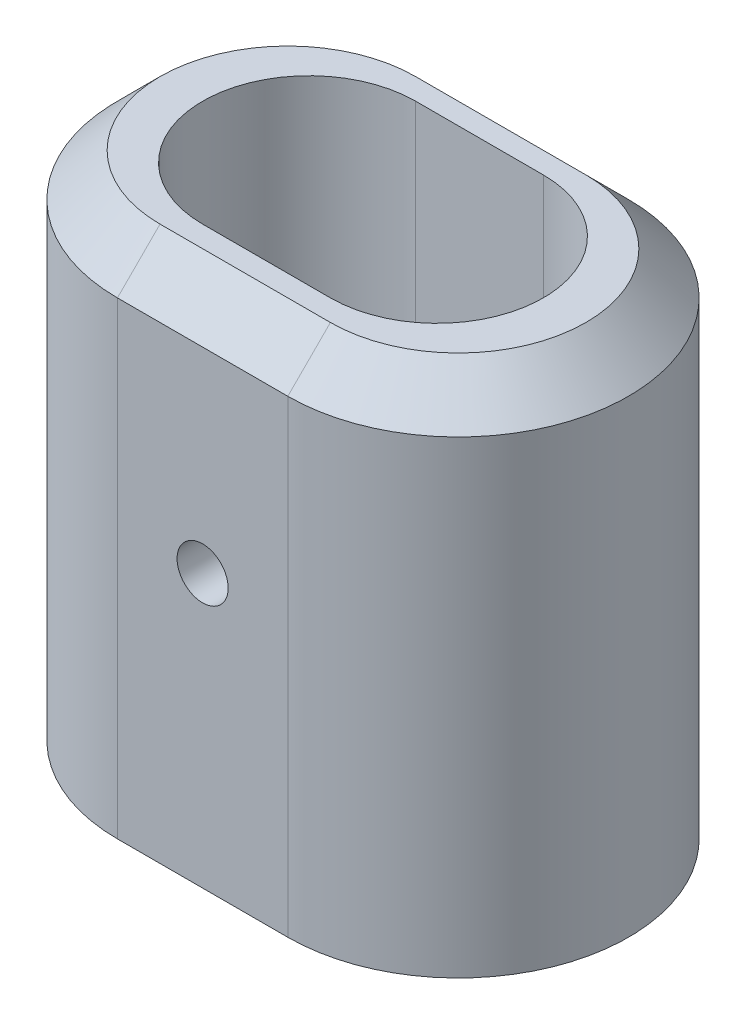
ISO-10303-21;
HEADER;
FILE_DESCRIPTION(('STEP AP214'),'2;1');
FILE_NAME('part.step','',(''),(''),'','','');
FILE_SCHEMA(('AUTOMOTIVE_DESIGN { 1 0 10303 214 1 1 1 1 }'));
ENDSEC;
DATA;
#1=APPLICATION_CONTEXT('core data for automotive mechanical design processes');
#2=APPLICATION_PROTOCOL_DEFINITION('international standard','automotive_design',2000,#1);
#3=PRODUCT_CONTEXT('',#1,'mechanical');
#4=PRODUCT('Part','Part','',(#3));
#5=PRODUCT_RELATED_PRODUCT_CATEGORY('part','',(#4));
#6=PRODUCT_DEFINITION_FORMATION('','',#4);
#7=PRODUCT_DEFINITION_CONTEXT('part definition',#1,'design');
#8=PRODUCT_DEFINITION('design','',#6,#7);
#9=PRODUCT_DEFINITION_SHAPE('','',#8);
#10=(LENGTH_UNIT() NAMED_UNIT(*) SI_UNIT(.MILLI.,.METRE.));
#11=(NAMED_UNIT(*) PLANE_ANGLE_UNIT() SI_UNIT($,.RADIAN.));
#12=(NAMED_UNIT(*) SI_UNIT($,.STERADIAN.) SOLID_ANGLE_UNIT());
#13=UNCERTAINTY_MEASURE_WITH_UNIT(LENGTH_MEASURE(1.E-05),#10,'distance_accuracy_value','');
#14=(GEOMETRIC_REPRESENTATION_CONTEXT(3) GLOBAL_UNCERTAINTY_ASSIGNED_CONTEXT((#13)) GLOBAL_UNIT_ASSIGNED_CONTEXT((#10,
#11,#12)) REPRESENTATION_CONTEXT('',''));
#15=CARTESIAN_POINT('',(0.,0.,0.));
#16=DIRECTION('',(0.,0.,1.));
#17=DIRECTION('',(1.,0.,0.));
#18=AXIS2_PLACEMENT_3D('',#15,#16,#17);
#19=CARTESIAN_POINT('',(-9.99999999999999,60.,0.));
#20=DIRECTION('',(0.,1.,0.));
#21=DIRECTION('',(0.,0.,1.));
#22=AXIS2_PLACEMENT_3D('',#19,#20,#21);
#23=PLANE('',#22);
#24=DIRECTION('',(-1.,0.,0.));
#25=VECTOR('',#24,1.);
#26=CARTESIAN_POINT('',(-9.99999999999999,60.,-15.));
#27=LINE('',#26,#25);
#28=CARTESIAN_POINT('',(9.99999999999999,60.,-15.));
#29=VERTEX_POINT('',#28);
#30=CARTESIAN_POINT('',(-9.99999999999999,60.,-15.));
#31=VERTEX_POINT('',#30);
#32=EDGE_CURVE('E183',#29,#31,#27,.T.);
#33=ORIENTED_EDGE('',*,*,#32,.T.);
#34=CARTESIAN_POINT('',(-9.99999999999999,60.,0.));
#35=DIRECTION('',(0.,1.,0.));
#36=DIRECTION('',(0.,0.,1.));
#37=AXIS2_PLACEMENT_3D('',#34,#35,#36);
#38=CIRCLE('',#37,15.);
#39=CARTESIAN_POINT('',(-9.99999999999999,60.,15.));
#40=VERTEX_POINT('',#39);
#41=EDGE_CURVE('E187',#31,#40,#38,.T.);
#42=ORIENTED_EDGE('',*,*,#41,.T.);
#43=DIRECTION('',(1.,0.,0.));
#44=VECTOR('',#43,1.);
#45=CARTESIAN_POINT('',(9.99999999999999,60.,15.));
#46=LINE('',#45,#44);
#47=CARTESIAN_POINT('',(9.99999999999999,60.,15.));
#48=VERTEX_POINT('',#47);
#49=EDGE_CURVE('E185',#40,#48,#46,.T.);
#50=ORIENTED_EDGE('',*,*,#49,.T.);
#51=CARTESIAN_POINT('',(9.99999999999999,60.,0.));
#52=DIRECTION('',(0.,1.,0.));
#53=DIRECTION('',(0.,0.,1.));
#54=AXIS2_PLACEMENT_3D('',#51,#52,#53);
#55=CIRCLE('',#54,15.);
#56=EDGE_CURVE('E181',#48,#29,#55,.T.);
#57=ORIENTED_EDGE('',*,*,#56,.T.);
#58=EDGE_LOOP('',(#33,#42,#50,#57));
#59=FACE_BOUND('',#58,.T.);
#60=DIRECTION('',(1.,0.,0.));
#61=VECTOR('',#60,1.);
#62=CARTESIAN_POINT('',(-7.5,60.,12.5));
#63=LINE('',#62,#61);
#64=CARTESIAN_POINT('',(-7.5,60.,12.5));
#65=VERTEX_POINT('',#64);
#66=CARTESIAN_POINT('',(7.5,60.,12.5));
#67=VERTEX_POINT('',#66);
#68=EDGE_CURVE('E129',#65,#67,#63,.T.);
#69=ORIENTED_EDGE('',*,*,#68,.F.);
#70=CARTESIAN_POINT('',(-7.5,60.,0.));
#71=DIRECTION('',(0.,1.,0.));
#72=DIRECTION('',(0.,0.,1.));
#73=AXIS2_PLACEMENT_3D('',#70,#71,#72);
#74=CIRCLE('',#73,12.5);
#75=CARTESIAN_POINT('',(-7.5,60.,-12.5));
#76=VERTEX_POINT('',#75);
#77=EDGE_CURVE('E119',#76,#65,#74,.T.);
#78=ORIENTED_EDGE('',*,*,#77,.F.);
#79=DIRECTION('',(-1.,0.,0.));
#80=VECTOR('',#79,1.);
#81=CARTESIAN_POINT('',(-7.5,60.,-12.5));
#82=LINE('',#81,#80);
#83=CARTESIAN_POINT('',(7.5,60.,-12.5));
#84=VERTEX_POINT('',#83);
#85=EDGE_CURVE('E144',#84,#76,#82,.T.);
#86=ORIENTED_EDGE('',*,*,#85,.F.);
#87=CARTESIAN_POINT('',(7.5,60.,0.));
#88=DIRECTION('',(0.,1.,0.));
#89=DIRECTION('',(0.,0.,1.));
#90=AXIS2_PLACEMENT_3D('',#87,#88,#89);
#91=CIRCLE('',#90,12.5);
#92=EDGE_CURVE('E142',#67,#84,#91,.T.);
#93=ORIENTED_EDGE('',*,*,#92,.F.);
#94=EDGE_LOOP('',(#69,#78,#86,#93));
#95=FACE_BOUND('',#94,.T.);
#96=ADVANCED_FACE('F40',(#59,#95),#23,.T.);
#97=CARTESIAN_POINT('',(-9.99999999999999,0.,0.));
#98=DIRECTION('',(0.,1.,0.));
#99=DIRECTION('',(0.,0.,1.));
#100=AXIS2_PLACEMENT_3D('',#97,#98,#99);
#101=PLANE('',#100);
#102=CARTESIAN_POINT('',(-9.99999999999999,0.,0.));
#103=DIRECTION('',(0.,1.,0.));
#104=DIRECTION('',(0.,0.,1.));
#105=AXIS2_PLACEMENT_3D('',#102,#103,#104);
#106=CIRCLE('',#105,20.);
#107=CARTESIAN_POINT('',(-9.99999999999999,0.,-20.));
#108=VERTEX_POINT('',#107);
#109=CARTESIAN_POINT('',(-9.99999999999999,0.,20.));
#110=VERTEX_POINT('',#109);
#111=EDGE_CURVE('E137',#108,#110,#106,.T.);
#112=ORIENTED_EDGE('',*,*,#111,.F.);
#113=DIRECTION('',(-1.,0.,0.));
#114=VECTOR('',#113,1.);
#115=CARTESIAN_POINT('',(-9.99999999999999,0.,-20.));
#116=LINE('',#115,#114);
#117=CARTESIAN_POINT('',(9.99999999999999,0.,-20.));
#118=VERTEX_POINT('',#117);
#119=EDGE_CURVE('E170',#118,#108,#116,.T.);
#120=ORIENTED_EDGE('',*,*,#119,.F.);
#121=CARTESIAN_POINT('',(9.99999999999999,0.,0.));
#122=DIRECTION('',(0.,1.,0.));
#123=DIRECTION('',(0.,0.,1.));
#124=AXIS2_PLACEMENT_3D('',#121,#122,#123);
#125=CIRCLE('',#124,20.);
#126=CARTESIAN_POINT('',(9.99999999999999,0.,20.));
#127=VERTEX_POINT('',#126);
#128=EDGE_CURVE('E167',#127,#118,#125,.T.);
#129=ORIENTED_EDGE('',*,*,#128,.F.);
#130=DIRECTION('',(1.,0.,0.));
#131=VECTOR('',#130,1.);
#132=CARTESIAN_POINT('',(-9.99999999999999,0.,20.));
#133=LINE('',#132,#131);
#134=EDGE_CURVE('E164',#110,#127,#133,.T.);
#135=ORIENTED_EDGE('',*,*,#134,.F.);
#136=EDGE_LOOP('',(#112,#120,#129,#135));
#137=FACE_BOUND('',#136,.T.);
#138=CARTESIAN_POINT('',(-7.5,0.,0.));
#139=DIRECTION('',(0.,1.,0.));
#140=DIRECTION('',(0.,0.,1.));
#141=AXIS2_PLACEMENT_3D('',#138,#139,#140);
#142=CIRCLE('',#141,12.5);
#143=CARTESIAN_POINT('',(-7.5,0.,-12.5));
#144=VERTEX_POINT('',#143);
#145=CARTESIAN_POINT('',(-7.5,0.,12.5));
#146=VERTEX_POINT('',#145);
#147=EDGE_CURVE('E149',#144,#146,#142,.T.);
#148=ORIENTED_EDGE('',*,*,#147,.T.);
#149=DIRECTION('',(1.,0.,0.));
#150=VECTOR('',#149,1.);
#151=CARTESIAN_POINT('',(-7.5,0.,12.5));
#152=LINE('',#151,#150);
#153=CARTESIAN_POINT('',(7.5,0.,12.5));
#154=VERTEX_POINT('',#153);
#155=EDGE_CURVE('E136',#146,#154,#152,.T.);
#156=ORIENTED_EDGE('',*,*,#155,.T.);
#157=CARTESIAN_POINT('',(7.5,0.,0.));
#158=DIRECTION('',(0.,1.,0.));
#159=DIRECTION('',(0.,0.,1.));
#160=AXIS2_PLACEMENT_3D('',#157,#158,#159);
#161=CIRCLE('',#160,12.5);
#162=CARTESIAN_POINT('',(7.5,0.,-12.5));
#163=VERTEX_POINT('',#162);
#164=EDGE_CURVE('E153',#154,#163,#161,.T.);
#165=ORIENTED_EDGE('',*,*,#164,.T.);
#166=DIRECTION('',(-1.,0.,0.));
#167=VECTOR('',#166,1.);
#168=CARTESIAN_POINT('',(-7.5,0.,-12.5));
#169=LINE('',#168,#167);
#170=EDGE_CURVE('E130',#163,#144,#169,.T.);
#171=ORIENTED_EDGE('',*,*,#170,.T.);
#172=EDGE_LOOP('',(#148,#156,#165,#171));
#173=FACE_BOUND('',#172,.T.);
#174=ADVANCED_FACE('F230',(#137,#173),#101,.F.);
#175=CARTESIAN_POINT('',(-9.99999999999999,60.,0.));
#176=DIRECTION('',(0.,-1.,0.));
#177=DIRECTION('',(0.,0.,-1.));
#178=AXIS2_PLACEMENT_3D('',#175,#176,#177);
#179=CYLINDRICAL_SURFACE('',#178,20.);
#180=DIRECTION('',(0.,-1.,0.));
#181=VECTOR('',#180,1.);
#182=CARTESIAN_POINT('',(-9.99999999999999,60.,20.));
#183=LINE('',#182,#181);
#184=CARTESIAN_POINT('',(-9.99999999999999,55.,20.));
#185=VERTEX_POINT('',#184);
#186=EDGE_CURVE('E179',#185,#110,#183,.T.);
#187=ORIENTED_EDGE('',*,*,#186,.F.);
#188=CARTESIAN_POINT('',(-9.99999999999999,55.,0.));
#189=DIRECTION('',(0.,1.,0.));
#190=DIRECTION('',(0.,0.,1.));
#191=AXIS2_PLACEMENT_3D('',#188,#189,#190);
#192=CIRCLE('',#191,20.);
#193=CARTESIAN_POINT('',(-9.99999999999999,55.,-20.));
#194=VERTEX_POINT('',#193);
#195=EDGE_CURVE('E190',#185,#194,#192,.F.);
#196=ORIENTED_EDGE('',*,*,#195,.T.);
#197=DIRECTION('',(0.,-1.,0.));
#198=VECTOR('',#197,1.);
#199=CARTESIAN_POINT('',(-9.99999999999999,60.,-20.));
#200=LINE('',#199,#198);
#201=EDGE_CURVE('E173',#194,#108,#200,.T.);
#202=ORIENTED_EDGE('',*,*,#201,.T.);
#203=ORIENTED_EDGE('',*,*,#111,.T.);
#204=EDGE_LOOP('',(#187,#196,#202,#203));
#205=FACE_BOUND('',#204,.T.);
#206=ADVANCED_FACE('F223',(#205),#179,.T.);
#207=CARTESIAN_POINT('',(-9.99999999999999,60.,20.));
#208=DIRECTION('',(0.,0.,-1.));
#209=DIRECTION('',(-1.,0.,0.));
#210=AXIS2_PLACEMENT_3D('',#207,#208,#209);
#211=PLANE('',#210);
#212=CARTESIAN_POINT('',(0.,32.,20.));
#213=DIRECTION('',(0.,0.,1.));
#214=DIRECTION('',(1.,0.,0.));
#215=AXIS2_PLACEMENT_3D('',#212,#213,#214);
#216=CIRCLE('',#215,3.);
#217=CARTESIAN_POINT('',(3.,32.,20.));
#218=VERTEX_POINT('',#217);
#219=EDGE_CURVE('E295',#218,#218,#216,.T.);
#220=ORIENTED_EDGE('',*,*,#219,.F.);
#221=EDGE_LOOP('',(#220));
#222=FACE_BOUND('',#221,.T.);
#223=DIRECTION('',(0.,-1.,0.));
#224=VECTOR('',#223,1.);
#225=CARTESIAN_POINT('',(9.99999999999999,60.,20.));
#226=LINE('',#225,#224);
#227=CARTESIAN_POINT('',(9.99999999999999,55.,20.));
#228=VERTEX_POINT('',#227);
#229=EDGE_CURVE('E177',#228,#127,#226,.T.);
#230=ORIENTED_EDGE('',*,*,#229,.F.);
#231=DIRECTION('',(-1.,0.,0.));
#232=VECTOR('',#231,1.);
#233=CARTESIAN_POINT('',(-9.99999999999999,55.,20.));
#234=LINE('',#233,#232);
#235=EDGE_CURVE('E193',#228,#185,#234,.T.);
#236=ORIENTED_EDGE('',*,*,#235,.T.);
#237=ORIENTED_EDGE('',*,*,#186,.T.);
#238=ORIENTED_EDGE('',*,*,#134,.T.);
#239=EDGE_LOOP('',(#230,#236,#237,#238));
#240=FACE_BOUND('',#239,.T.);
#241=ADVANCED_FACE('F219',(#222,#240),#211,.F.);
#242=CARTESIAN_POINT('',(9.99999999999999,60.,0.));
#243=DIRECTION('',(0.,-1.,0.));
#244=DIRECTION('',(0.,0.,-1.));
#245=AXIS2_PLACEMENT_3D('',#242,#243,#244);
#246=CYLINDRICAL_SURFACE('',#245,20.);
#247=DIRECTION('',(0.,-1.,0.));
#248=VECTOR('',#247,1.);
#249=CARTESIAN_POINT('',(9.99999999999999,60.,-20.));
#250=LINE('',#249,#248);
#251=CARTESIAN_POINT('',(9.99999999999999,55.,-20.));
#252=VERTEX_POINT('',#251);
#253=EDGE_CURVE('E175',#252,#118,#250,.T.);
#254=ORIENTED_EDGE('',*,*,#253,.F.);
#255=CARTESIAN_POINT('',(9.99999999999999,55.,0.));
#256=DIRECTION('',(0.,1.,0.));
#257=DIRECTION('',(0.,0.,1.));
#258=AXIS2_PLACEMENT_3D('',#255,#256,#257);
#259=CIRCLE('',#258,20.);
#260=EDGE_CURVE('E11',#252,#228,#259,.F.);
#261=ORIENTED_EDGE('',*,*,#260,.T.);
#262=ORIENTED_EDGE('',*,*,#229,.T.);
#263=ORIENTED_EDGE('',*,*,#128,.T.);
#264=EDGE_LOOP('',(#254,#261,#262,#263));
#265=FACE_BOUND('',#264,.T.);
#266=ADVANCED_FACE('F243',(#265),#246,.T.);
#267=CARTESIAN_POINT('',(-9.99999999999999,60.,-20.));
#268=DIRECTION('',(0.,0.,1.));
#269=DIRECTION('',(1.,0.,0.));
#270=AXIS2_PLACEMENT_3D('',#267,#268,#269);
#271=PLANE('',#270);
#272=CARTESIAN_POINT('',(0.,32.,-20.));
#273=DIRECTION('',(0.,0.,1.));
#274=DIRECTION('',(1.,0.,0.));
#275=AXIS2_PLACEMENT_3D('',#272,#273,#274);
#276=CIRCLE('',#275,3.);
#277=CARTESIAN_POINT('',(3.,32.,-20.));
#278=VERTEX_POINT('',#277);
#279=EDGE_CURVE('E293',#278,#278,#276,.T.);
#280=ORIENTED_EDGE('',*,*,#279,.T.);
#281=EDGE_LOOP('',(#280));
#282=FACE_BOUND('',#281,.T.);
#283=ORIENTED_EDGE('',*,*,#201,.F.);
#284=DIRECTION('',(1.,0.,0.));
#285=VECTOR('',#284,1.);
#286=CARTESIAN_POINT('',(9.99999999999999,55.,-20.));
#287=LINE('',#286,#285);
#288=EDGE_CURVE('E50',#194,#252,#287,.T.);
#289=ORIENTED_EDGE('',*,*,#288,.T.);
#290=ORIENTED_EDGE('',*,*,#253,.T.);
#291=ORIENTED_EDGE('',*,*,#119,.T.);
#292=EDGE_LOOP('',(#283,#289,#290,#291));
#293=FACE_BOUND('',#292,.T.);
#294=ADVANCED_FACE('F240',(#282,#293),#271,.F.);
#295=CARTESIAN_POINT('',(-7.5,60.,0.));
#296=DIRECTION('',(0.,-1.,0.));
#297=DIRECTION('',(0.,0.,-1.));
#298=AXIS2_PLACEMENT_3D('',#295,#296,#297);
#299=CYLINDRICAL_SURFACE('',#298,12.5);
#300=ORIENTED_EDGE('',*,*,#147,.F.);
#301=DIRECTION('',(0.,-1.,0.));
#302=VECTOR('',#301,1.);
#303=CARTESIAN_POINT('',(-7.5,60.,-12.5));
#304=LINE('',#303,#302);
#305=EDGE_CURVE('E125',#76,#144,#304,.T.);
#306=ORIENTED_EDGE('',*,*,#305,.F.);
#307=ORIENTED_EDGE('',*,*,#77,.T.);
#308=DIRECTION('',(0.,-1.,0.));
#309=VECTOR('',#308,1.);
#310=CARTESIAN_POINT('',(-7.5,60.,12.5));
#311=LINE('',#310,#309);
#312=EDGE_CURVE('E122',#65,#146,#311,.T.);
#313=ORIENTED_EDGE('',*,*,#312,.T.);
#314=EDGE_LOOP('',(#300,#306,#307,#313));
#315=FACE_BOUND('',#314,.T.);
#316=ADVANCED_FACE('F121',(#315),#299,.F.);
#317=CARTESIAN_POINT('',(-7.5,60.,12.5));
#318=DIRECTION('',(0.,0.,-1.));
#319=DIRECTION('',(-1.,0.,0.));
#320=AXIS2_PLACEMENT_3D('',#317,#318,#319);
#321=PLANE('',#320);
#322=CARTESIAN_POINT('',(0.,32.,12.5));
#323=DIRECTION('',(0.,0.,-1.));
#324=DIRECTION('',(-1.,0.,0.));
#325=AXIS2_PLACEMENT_3D('',#322,#323,#324);
#326=CIRCLE('',#325,3.);
#327=CARTESIAN_POINT('',(-3.,32.,12.5));
#328=VERTEX_POINT('',#327);
#329=EDGE_CURVE('E199',#328,#328,#326,.T.);
#330=ORIENTED_EDGE('',*,*,#329,.F.);
#331=EDGE_LOOP('',(#330));
#332=FACE_BOUND('',#331,.T.);
#333=ORIENTED_EDGE('',*,*,#155,.F.);
#334=ORIENTED_EDGE('',*,*,#312,.F.);
#335=ORIENTED_EDGE('',*,*,#68,.T.);
#336=DIRECTION('',(0.,-1.,0.));
#337=VECTOR('',#336,1.);
#338=CARTESIAN_POINT('',(7.5,60.,12.5));
#339=LINE('',#338,#337);
#340=EDGE_CURVE('E138',#67,#154,#339,.T.);
#341=ORIENTED_EDGE('',*,*,#340,.T.);
#342=EDGE_LOOP('',(#333,#334,#335,#341));
#343=FACE_BOUND('',#342,.T.);
#344=ADVANCED_FACE('F133',(#332,#343),#321,.T.);
#345=CARTESIAN_POINT('',(7.5,60.,0.));
#346=DIRECTION('',(0.,-1.,0.));
#347=DIRECTION('',(0.,0.,-1.));
#348=AXIS2_PLACEMENT_3D('',#345,#346,#347);
#349=CYLINDRICAL_SURFACE('',#348,12.5);
#350=ORIENTED_EDGE('',*,*,#164,.F.);
#351=ORIENTED_EDGE('',*,*,#340,.F.);
#352=ORIENTED_EDGE('',*,*,#92,.T.);
#353=DIRECTION('',(0.,-1.,0.));
#354=VECTOR('',#353,1.);
#355=CARTESIAN_POINT('',(7.5,60.,-12.5));
#356=LINE('',#355,#354);
#357=EDGE_CURVE('E159',#84,#163,#356,.T.);
#358=ORIENTED_EDGE('',*,*,#357,.T.);
#359=EDGE_LOOP('',(#350,#351,#352,#358));
#360=FACE_BOUND('',#359,.T.);
#361=ADVANCED_FACE('F273',(#360),#349,.F.);
#362=CARTESIAN_POINT('',(-7.5,60.,-12.5));
#363=DIRECTION('',(0.,0.,1.));
#364=DIRECTION('',(1.,0.,0.));
#365=AXIS2_PLACEMENT_3D('',#362,#363,#364);
#366=PLANE('',#365);
#367=CARTESIAN_POINT('',(0.,32.,-12.5));
#368=DIRECTION('',(0.,0.,1.));
#369=DIRECTION('',(1.,0.,0.));
#370=AXIS2_PLACEMENT_3D('',#367,#368,#369);
#371=CIRCLE('',#370,3.);
#372=CARTESIAN_POINT('',(3.,32.,-12.5));
#373=VERTEX_POINT('',#372);
#374=EDGE_CURVE('E45',#373,#373,#371,.T.);
#375=ORIENTED_EDGE('',*,*,#374,.F.);
#376=EDGE_LOOP('',(#375));
#377=FACE_BOUND('',#376,.T.);
#378=ORIENTED_EDGE('',*,*,#170,.F.);
#379=ORIENTED_EDGE('',*,*,#357,.F.);
#380=ORIENTED_EDGE('',*,*,#85,.T.);
#381=ORIENTED_EDGE('',*,*,#305,.T.);
#382=EDGE_LOOP('',(#378,#379,#380,#381));
#383=FACE_BOUND('',#382,.T.);
#384=ADVANCED_FACE('F269',(#377,#383),#366,.T.);
#385=CARTESIAN_POINT('',(9.99999999999999,60.,0.));
#386=DIRECTION('',(0.,-1.,0.));
#387=DIRECTION('',(0.,0.,-1.));
#388=AXIS2_PLACEMENT_3D('',#385,#386,#387);
#389=CONICAL_SURFACE('',#388,15.,0.785398163397447);
#390=DIRECTION('',(0.,0.707106781186548,-0.707106781186547));
#391=VECTOR('',#390,1.);
#392=CARTESIAN_POINT('',(9.99999999999999,55.,20.));
#393=LINE('',#392,#391);
#394=EDGE_CURVE('E201',#228,#48,#393,.T.);
#395=ORIENTED_EDGE('',*,*,#394,.F.);
#396=ORIENTED_EDGE('',*,*,#260,.F.);
#397=DIRECTION('',(0.,-0.707106781186548,-0.707106781186547));
#398=VECTOR('',#397,1.);
#399=CARTESIAN_POINT('',(9.99999999999999,60.,-15.));
#400=LINE('',#399,#398);
#401=EDGE_CURVE('E151',#29,#252,#400,.T.);
#402=ORIENTED_EDGE('',*,*,#401,.F.);
#403=ORIENTED_EDGE('',*,*,#56,.F.);
#404=EDGE_LOOP('',(#395,#396,#402,#403));
#405=FACE_BOUND('',#404,.T.);
#406=ADVANCED_FACE('F43',(#405),#389,.T.);
#407=CARTESIAN_POINT('',(-10.,60.,-15.));
#408=DIRECTION('',(0.,0.707106781186547,-0.707106781186548));
#409=DIRECTION('',(1.,0.,0.));
#410=AXIS2_PLACEMENT_3D('',#407,#408,#409);
#411=PLANE('',#410);
#412=ORIENTED_EDGE('',*,*,#401,.T.);
#413=ORIENTED_EDGE('',*,*,#288,.F.);
#414=DIRECTION('',(0.,-0.707106781186548,-0.707106781186547));
#415=VECTOR('',#414,1.);
#416=CARTESIAN_POINT('',(-9.99999999999999,60.,-15.));
#417=LINE('',#416,#415);
#418=EDGE_CURVE('E198',#31,#194,#417,.T.);
#419=ORIENTED_EDGE('',*,*,#418,.F.);
#420=ORIENTED_EDGE('',*,*,#32,.F.);
#421=EDGE_LOOP('',(#412,#413,#419,#420));
#422=FACE_BOUND('',#421,.T.);
#423=ADVANCED_FACE('F207',(#422),#411,.T.);
#424=CARTESIAN_POINT('',(-10.,60.,15.));
#425=DIRECTION('',(0.,0.707106781186547,0.707106781186548));
#426=DIRECTION('',(-1.,0.,0.));
#427=AXIS2_PLACEMENT_3D('',#424,#425,#426);
#428=PLANE('',#427);
#429=ORIENTED_EDGE('',*,*,#394,.T.);
#430=ORIENTED_EDGE('',*,*,#49,.F.);
#431=DIRECTION('',(0.,0.707106781186548,-0.707106781186547));
#432=VECTOR('',#431,1.);
#433=CARTESIAN_POINT('',(-9.99999999999999,55.,20.));
#434=LINE('',#433,#432);
#435=EDGE_CURVE('E196',#185,#40,#434,.T.);
#436=ORIENTED_EDGE('',*,*,#435,.F.);
#437=ORIENTED_EDGE('',*,*,#235,.F.);
#438=EDGE_LOOP('',(#429,#430,#436,#437));
#439=FACE_BOUND('',#438,.T.);
#440=ADVANCED_FACE('F216',(#439),#428,.T.);
#441=CARTESIAN_POINT('',(-9.99999999999999,60.,0.));
#442=DIRECTION('',(0.,-1.,0.));
#443=DIRECTION('',(0.,0.,-1.));
#444=AXIS2_PLACEMENT_3D('',#441,#442,#443);
#445=CONICAL_SURFACE('',#444,15.,0.785398163397447);
#446=ORIENTED_EDGE('',*,*,#418,.T.);
#447=ORIENTED_EDGE('',*,*,#195,.F.);
#448=ORIENTED_EDGE('',*,*,#435,.T.);
#449=ORIENTED_EDGE('',*,*,#41,.F.);
#450=EDGE_LOOP('',(#446,#447,#448,#449));
#451=FACE_BOUND('',#450,.T.);
#452=ADVANCED_FACE('F226',(#451),#445,.T.);
#453=CARTESIAN_POINT('',(0.,32.,-20.));
#454=DIRECTION('',(0.,0.,1.));
#455=DIRECTION('',(1.,0.,0.));
#456=AXIS2_PLACEMENT_3D('',#453,#454,#455);
#457=CYLINDRICAL_SURFACE('',#456,3.);
#458=ORIENTED_EDGE('',*,*,#374,.T.);
#459=EDGE_LOOP('',(#458));
#460=FACE_BOUND('',#459,.T.);
#461=ORIENTED_EDGE('',*,*,#279,.F.);
#462=EDGE_LOOP('',(#461));
#463=FACE_BOUND('',#462,.T.);
#464=ADVANCED_FACE('F258',(#460,#463),#457,.F.);
#465=ORIENTED_EDGE('',*,*,#329,.T.);
#466=EDGE_LOOP('',(#465));
#467=FACE_BOUND('',#466,.T.);
#468=ORIENTED_EDGE('',*,*,#219,.T.);
#469=EDGE_LOOP('',(#468));
#470=FACE_BOUND('',#469,.T.);
#471=ADVANCED_FACE('F302',(#467,#470),#457,.F.);
#472=CLOSED_SHELL('',(#96,#174,#206,#241,#266,#294,#316,#344,#361,#384,#406,#423,#440,#452,#464,#471));
#473=MANIFOLD_SOLID_BREP('B2',#472);
#474=ADVANCED_BREP_SHAPE_REPRESENTATION('',(#18,#473),#14);
#475=SHAPE_DEFINITION_REPRESENTATION(#9,#474);
ENDSEC;
END-ISO-10303-21;
